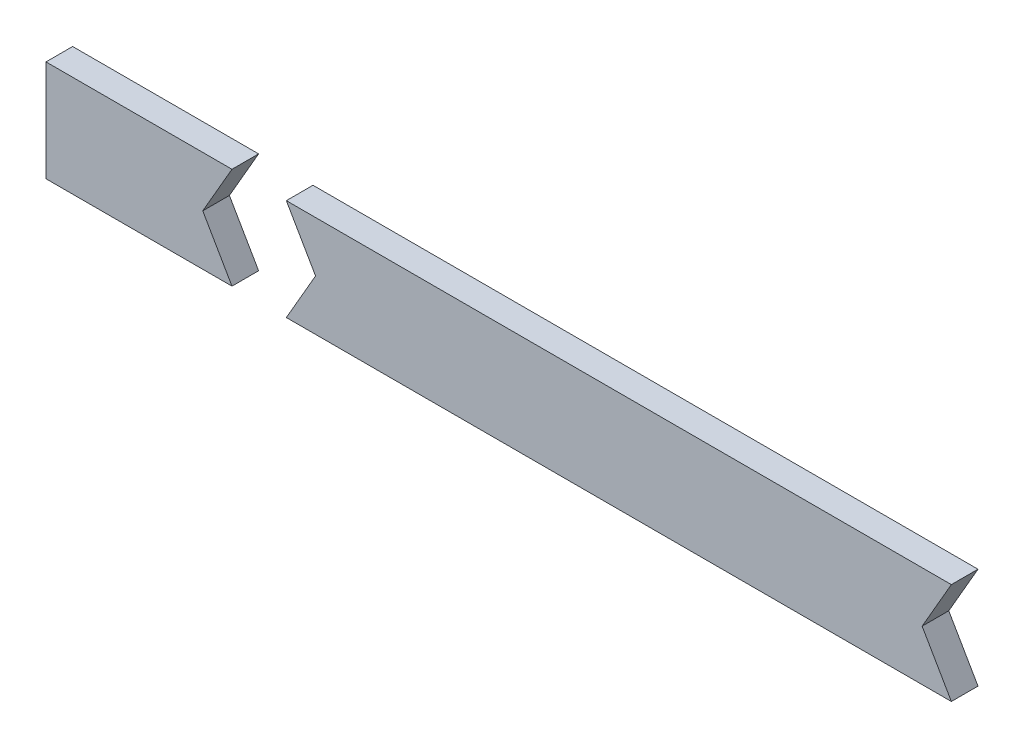
ISO-10303-21;
HEADER;
FILE_DESCRIPTION(('STEP AP214'),'2;1');
FILE_NAME('part.step','',(''),(''),'','','');
FILE_SCHEMA(('AUTOMOTIVE_DESIGN { 1 0 10303 214 1 1 1 1 }'));
ENDSEC;
DATA;
#1=APPLICATION_CONTEXT('core data for automotive mechanical design processes');
#2=APPLICATION_PROTOCOL_DEFINITION('international standard','automotive_design',2000,#1);
#3=PRODUCT_CONTEXT('',#1,'mechanical');
#4=PRODUCT('Part','Part','',(#3));
#5=PRODUCT_RELATED_PRODUCT_CATEGORY('part','',(#4));
#6=PRODUCT_DEFINITION_FORMATION('','',#4);
#7=PRODUCT_DEFINITION_CONTEXT('part definition',#1,'design');
#8=PRODUCT_DEFINITION('design','',#6,#7);
#9=PRODUCT_DEFINITION_SHAPE('','',#8);
#10=(LENGTH_UNIT() NAMED_UNIT(*) SI_UNIT(.MILLI.,.METRE.));
#11=(NAMED_UNIT(*) PLANE_ANGLE_UNIT() SI_UNIT($,.RADIAN.));
#12=(NAMED_UNIT(*) SI_UNIT($,.STERADIAN.) SOLID_ANGLE_UNIT());
#13=UNCERTAINTY_MEASURE_WITH_UNIT(LENGTH_MEASURE(1.E-05),#10,'distance_accuracy_value','');
#14=(GEOMETRIC_REPRESENTATION_CONTEXT(3) GLOBAL_UNCERTAINTY_ASSIGNED_CONTEXT((#13)) GLOBAL_UNIT_ASSIGNED_CONTEXT((#10,
#11,#12)) REPRESENTATION_CONTEXT('',''));
#15=CARTESIAN_POINT('',(0.,0.,0.));
#16=DIRECTION('',(0.,0.,1.));
#17=DIRECTION('',(1.,0.,0.));
#18=AXIS2_PLACEMENT_3D('',#15,#16,#17);
#19=CARTESIAN_POINT('',(50.9700217866475,2.85,39.3714518175661));
#20=DIRECTION('',(0.,-1.,0.));
#21=DIRECTION('',(0.,0.,-1.));
#22=AXIS2_PLACEMENT_3D('',#19,#20,#21);
#23=PLANE('',#22);
#24=DIRECTION('',(-1.,0.,0.));
#25=VECTOR('',#24,1.);
#26=CARTESIAN_POINT('',(50.9700217866475,2.85,1.5));
#27=LINE('',#26,#25);
#28=CARTESIAN_POINT('',(50.9700217866475,2.85,1.5));
#29=VERTEX_POINT('',#28);
#30=CARTESIAN_POINT('',(13.5299782133525,2.85,1.5));
#31=VERTEX_POINT('',#30);
#32=EDGE_CURVE('E124',#29,#31,#27,.T.);
#33=ORIENTED_EDGE('',*,*,#32,.F.);
#34=DIRECTION('',(0.,0.,-1.));
#35=VECTOR('',#34,1.);
#36=CARTESIAN_POINT('',(50.9700217866475,2.85,39.3714518175661));
#37=LINE('',#36,#35);
#38=CARTESIAN_POINT('',(50.9700217866475,2.85,0.));
#39=VERTEX_POINT('',#38);
#40=EDGE_CURVE('E47',#29,#39,#37,.T.);
#41=ORIENTED_EDGE('',*,*,#40,.T.);
#42=DIRECTION('',(-1.,0.,0.));
#43=VECTOR('',#42,1.);
#44=CARTESIAN_POINT('',(50.9700217866475,2.85,0.));
#45=LINE('',#44,#43);
#46=CARTESIAN_POINT('',(13.5299782133525,2.85,0.));
#47=VERTEX_POINT('',#46);
#48=EDGE_CURVE('E132',#39,#47,#45,.T.);
#49=ORIENTED_EDGE('',*,*,#48,.T.);
#50=DIRECTION('',(0.,0.,-1.));
#51=VECTOR('',#50,1.);
#52=CARTESIAN_POINT('',(13.5299782133525,2.85,39.3714518175661));
#53=LINE('',#52,#51);
#54=EDGE_CURVE('E90',#31,#47,#53,.T.);
#55=ORIENTED_EDGE('',*,*,#54,.F.);
#56=EDGE_LOOP('',(#33,#41,#49,#55));
#57=FACE_BOUND('',#56,.T.);
#58=ADVANCED_FACE('F43',(#57),#23,.F.);
#59=CARTESIAN_POINT('',(13.5299782133525,2.85,39.3714518175661));
#60=DIRECTION('',(0.866025403784441,0.499999999999997,0.));
#61=DIRECTION('',(-0.499999999999997,0.866025403784441,0.));
#62=AXIS2_PLACEMENT_3D('',#59,#60,#61);
#63=PLANE('',#62);
#64=DIRECTION('',(0.499999999999997,-0.866025403784441,0.));
#65=VECTOR('',#64,1.);
#66=CARTESIAN_POINT('',(13.5299782133525,2.85,1.5));
#67=LINE('',#66,#65);
#68=CARTESIAN_POINT('',(15.1754264805429,0.,1.5));
#69=VERTEX_POINT('',#68);
#70=EDGE_CURVE('E97',#31,#69,#67,.T.);
#71=ORIENTED_EDGE('',*,*,#70,.F.);
#72=ORIENTED_EDGE('',*,*,#54,.T.);
#73=DIRECTION('',(0.499999999999997,-0.86602540378444,0.));
#74=VECTOR('',#73,1.);
#75=CARTESIAN_POINT('',(13.5299782133525,2.85,0.));
#76=LINE('',#75,#74);
#77=CARTESIAN_POINT('',(15.1754264805429,0.,0.));
#78=VERTEX_POINT('',#77);
#79=EDGE_CURVE('E131',#47,#78,#76,.T.);
#80=ORIENTED_EDGE('',*,*,#79,.T.);
#81=DIRECTION('',(0.,0.,-1.));
#82=VECTOR('',#81,1.);
#83=CARTESIAN_POINT('',(15.1754264805429,0.,39.3714518175661));
#84=LINE('',#83,#82);
#85=EDGE_CURVE('E133',#69,#78,#84,.T.);
#86=ORIENTED_EDGE('',*,*,#85,.F.);
#87=EDGE_LOOP('',(#71,#72,#80,#86));
#88=FACE_BOUND('',#87,.T.);
#89=ADVANCED_FACE('F151',(#88),#63,.F.);
#90=CARTESIAN_POINT('',(15.1754264805429,0.,39.3714518175661));
#91=DIRECTION('',(0.866025403784439,-0.499999999999999,0.));
#92=DIRECTION('',(0.499999999999999,0.866025403784439,0.));
#93=AXIS2_PLACEMENT_3D('',#90,#91,#92);
#94=PLANE('',#93);
#95=DIRECTION('',(-0.499999999999999,-0.866025403784439,0.));
#96=VECTOR('',#95,1.);
#97=CARTESIAN_POINT('',(15.1754264805429,0.,1.5));
#98=LINE('',#97,#96);
#99=CARTESIAN_POINT('',(13.5299782133525,-2.85,1.5));
#100=VERTEX_POINT('',#99);
#101=EDGE_CURVE('E118',#69,#100,#98,.T.);
#102=ORIENTED_EDGE('',*,*,#101,.F.);
#103=ORIENTED_EDGE('',*,*,#85,.T.);
#104=DIRECTION('',(-0.499999999999999,-0.866025403784439,0.));
#105=VECTOR('',#104,1.);
#106=CARTESIAN_POINT('',(15.1754264805429,0.,0.));
#107=LINE('',#106,#105);
#108=CARTESIAN_POINT('',(13.5299782133525,-2.85,0.));
#109=VERTEX_POINT('',#108);
#110=EDGE_CURVE('E135',#78,#109,#107,.T.);
#111=ORIENTED_EDGE('',*,*,#110,.T.);
#112=DIRECTION('',(0.,0.,-1.));
#113=VECTOR('',#112,1.);
#114=CARTESIAN_POINT('',(13.5299782133525,-2.85,39.3714518175661));
#115=LINE('',#114,#113);
#116=EDGE_CURVE('E136',#100,#109,#115,.T.);
#117=ORIENTED_EDGE('',*,*,#116,.F.);
#118=EDGE_LOOP('',(#102,#103,#111,#117));
#119=FACE_BOUND('',#118,.T.);
#120=ADVANCED_FACE('F153',(#119),#94,.F.);
#121=CARTESIAN_POINT('',(13.5299782133525,-2.85,39.3714518175661));
#122=DIRECTION('',(0.,1.,0.));
#123=DIRECTION('',(0.,0.,1.));
#124=AXIS2_PLACEMENT_3D('',#121,#122,#123);
#125=PLANE('',#124);
#126=DIRECTION('',(1.,0.,0.));
#127=VECTOR('',#126,1.);
#128=CARTESIAN_POINT('',(13.5299782133525,-2.85,1.5));
#129=LINE('',#128,#127);
#130=CARTESIAN_POINT('',(50.9700217866475,-2.85,1.5));
#131=VERTEX_POINT('',#130);
#132=EDGE_CURVE('E52',#100,#131,#129,.T.);
#133=ORIENTED_EDGE('',*,*,#132,.F.);
#134=ORIENTED_EDGE('',*,*,#116,.T.);
#135=DIRECTION('',(1.,0.,0.));
#136=VECTOR('',#135,1.);
#137=CARTESIAN_POINT('',(13.5299782133525,-2.85,0.));
#138=LINE('',#137,#136);
#139=CARTESIAN_POINT('',(50.9700217866475,-2.85,0.));
#140=VERTEX_POINT('',#139);
#141=EDGE_CURVE('E113',#109,#140,#138,.T.);
#142=ORIENTED_EDGE('',*,*,#141,.T.);
#143=DIRECTION('',(0.,0.,-1.));
#144=VECTOR('',#143,1.);
#145=CARTESIAN_POINT('',(50.9700217866475,-2.85,39.3714518175661));
#146=LINE('',#145,#144);
#147=EDGE_CURVE('E104',#131,#140,#146,.T.);
#148=ORIENTED_EDGE('',*,*,#147,.F.);
#149=EDGE_LOOP('',(#133,#134,#142,#148));
#150=FACE_BOUND('',#149,.T.);
#151=ADVANCED_FACE('F110',(#150),#125,.F.);
#152=CARTESIAN_POINT('',(50.9700217866475,-2.85,39.3714518175661));
#153=DIRECTION('',(-0.866025403784437,-0.500000000000003,0.));
#154=DIRECTION('',(0.500000000000003,-0.866025403784437,0.));
#155=AXIS2_PLACEMENT_3D('',#152,#153,#154);
#156=PLANE('',#155);
#157=DIRECTION('',(-0.500000000000003,0.866025403784437,0.));
#158=VECTOR('',#157,1.);
#159=CARTESIAN_POINT('',(50.9700217866475,-2.85,1.5));
#160=LINE('',#159,#158);
#161=CARTESIAN_POINT('',(49.3245735194571,0.,1.5));
#162=VERTEX_POINT('',#161);
#163=EDGE_CURVE('E12',#131,#162,#160,.T.);
#164=ORIENTED_EDGE('',*,*,#163,.F.);
#165=ORIENTED_EDGE('',*,*,#147,.T.);
#166=DIRECTION('',(-0.500000000000003,0.866025403784437,0.));
#167=VECTOR('',#166,1.);
#168=CARTESIAN_POINT('',(50.9700217866475,-2.85,0.));
#169=LINE('',#168,#167);
#170=CARTESIAN_POINT('',(49.3245735194571,0.,0.));
#171=VERTEX_POINT('',#170);
#172=EDGE_CURVE('E115',#140,#171,#169,.T.);
#173=ORIENTED_EDGE('',*,*,#172,.T.);
#174=DIRECTION('',(0.,0.,-1.));
#175=VECTOR('',#174,1.);
#176=CARTESIAN_POINT('',(49.3245735194571,0.,39.3714518175661));
#177=LINE('',#176,#175);
#178=EDGE_CURVE('E65',#162,#171,#177,.T.);
#179=ORIENTED_EDGE('',*,*,#178,.F.);
#180=EDGE_LOOP('',(#164,#165,#173,#179));
#181=FACE_BOUND('',#180,.T.);
#182=ADVANCED_FACE('F103',(#181),#156,.F.);
#183=CARTESIAN_POINT('',(49.3245735194571,0.,39.3714518175661));
#184=DIRECTION('',(-0.866025403784439,0.499999999999999,0.));
#185=DIRECTION('',(-0.499999999999999,-0.866025403784439,0.));
#186=AXIS2_PLACEMENT_3D('',#183,#184,#185);
#187=PLANE('',#186);
#188=DIRECTION('',(0.499999999999999,0.866025403784439,0.));
#189=VECTOR('',#188,1.);
#190=CARTESIAN_POINT('',(49.3245735194571,0.,1.5));
#191=LINE('',#190,#189);
#192=EDGE_CURVE('E127',#162,#29,#191,.T.);
#193=ORIENTED_EDGE('',*,*,#192,.F.);
#194=ORIENTED_EDGE('',*,*,#178,.T.);
#195=DIRECTION('',(0.499999999999999,0.866025403784439,0.));
#196=VECTOR('',#195,1.);
#197=CARTESIAN_POINT('',(49.3245735194571,0.,0.));
#198=LINE('',#197,#196);
#199=EDGE_CURVE('E129',#171,#39,#198,.T.);
#200=ORIENTED_EDGE('',*,*,#199,.T.);
#201=ORIENTED_EDGE('',*,*,#40,.F.);
#202=EDGE_LOOP('',(#193,#194,#200,#201));
#203=FACE_BOUND('',#202,.T.);
#204=ADVANCED_FACE('F147',(#203),#187,.F.);
#205=CARTESIAN_POINT('',(0.,0.,0.));
#206=DIRECTION('',(0.,0.,1.));
#207=DIRECTION('',(1.,0.,0.));
#208=AXIS2_PLACEMENT_3D('',#205,#206,#207);
#209=PLANE('',#208);
#210=ORIENTED_EDGE('',*,*,#48,.F.);
#211=ORIENTED_EDGE('',*,*,#199,.F.);
#212=ORIENTED_EDGE('',*,*,#172,.F.);
#213=ORIENTED_EDGE('',*,*,#141,.F.);
#214=ORIENTED_EDGE('',*,*,#110,.F.);
#215=ORIENTED_EDGE('',*,*,#79,.F.);
#216=EDGE_LOOP('',(#210,#211,#212,#213,#214,#215));
#217=FACE_BOUND('',#216,.T.);
#218=ADVANCED_FACE('F149',(#217),#209,.F.);
#219=CARTESIAN_POINT('',(0.,0.,1.5));
#220=DIRECTION('',(0.,0.,1.));
#221=DIRECTION('',(1.,0.,0.));
#222=AXIS2_PLACEMENT_3D('',#219,#220,#221);
#223=PLANE('',#222);
#224=ORIENTED_EDGE('',*,*,#192,.T.);
#225=ORIENTED_EDGE('',*,*,#32,.T.);
#226=ORIENTED_EDGE('',*,*,#70,.T.);
#227=ORIENTED_EDGE('',*,*,#101,.T.);
#228=ORIENTED_EDGE('',*,*,#132,.T.);
#229=ORIENTED_EDGE('',*,*,#163,.T.);
#230=EDGE_LOOP('',(#224,#225,#226,#227,#228,#229));
#231=FACE_BOUND('',#230,.T.);
#232=ADVANCED_FACE('F45',(#231),#223,.T.);
#233=CLOSED_SHELL('',(#58,#89,#120,#151,#182,#204,#218,#232));
#234=MANIFOLD_SOLID_BREP('B2',#233);
#235=CARTESIAN_POINT('',(10.4700217866475,2.85,1.5));
#236=DIRECTION('',(0.,-1.,0.));
#237=DIRECTION('',(0.,0.,-1.));
#238=AXIS2_PLACEMENT_3D('',#235,#236,#237);
#239=PLANE('',#238);
#240=DIRECTION('',(-1.,0.,0.));
#241=VECTOR('',#240,1.);
#242=CARTESIAN_POINT('',(10.4700217866475,2.85,0.));
#243=LINE('',#242,#241);
#244=CARTESIAN_POINT('',(10.4700217866475,2.85,0.));
#245=VERTEX_POINT('',#244);
#246=CARTESIAN_POINT('',(0.,2.85,0.));
#247=VERTEX_POINT('',#246);
#248=EDGE_CURVE('E292',#245,#247,#243,.T.);
#249=ORIENTED_EDGE('',*,*,#248,.T.);
#250=DIRECTION('',(0.,0.,-1.));
#251=VECTOR('',#250,1.);
#252=CARTESIAN_POINT('',(0.,2.85,1.5));
#253=LINE('',#252,#251);
#254=CARTESIAN_POINT('',(0.,2.85,1.5));
#255=VERTEX_POINT('',#254);
#256=EDGE_CURVE('E41',#255,#247,#253,.T.);
#257=ORIENTED_EDGE('',*,*,#256,.F.);
#258=DIRECTION('',(-1.,0.,0.));
#259=VECTOR('',#258,1.);
#260=CARTESIAN_POINT('',(10.4700217866475,2.85,1.5));
#261=LINE('',#260,#259);
#262=CARTESIAN_POINT('',(10.4700217866475,2.85,1.5));
#263=VERTEX_POINT('',#262);
#264=EDGE_CURVE('E300',#263,#255,#261,.T.);
#265=ORIENTED_EDGE('',*,*,#264,.F.);
#266=DIRECTION('',(0.,0.,-1.));
#267=VECTOR('',#266,1.);
#268=CARTESIAN_POINT('',(10.4700217866475,2.85,1.5));
#269=LINE('',#268,#267);
#270=EDGE_CURVE('E288',#263,#245,#269,.T.);
#271=ORIENTED_EDGE('',*,*,#270,.T.);
#272=EDGE_LOOP('',(#249,#257,#265,#271));
#273=FACE_BOUND('',#272,.T.);
#274=ADVANCED_FACE('F218',(#273),#239,.F.);
#275=CARTESIAN_POINT('',(0.,2.85,1.5));
#276=DIRECTION('',(1.,0.,0.));
#277=DIRECTION('',(0.,0.,-1.));
#278=AXIS2_PLACEMENT_3D('',#275,#276,#277);
#279=PLANE('',#278);
#280=DIRECTION('',(0.,-1.,0.));
#281=VECTOR('',#280,1.);
#282=CARTESIAN_POINT('',(0.,2.85,0.));
#283=LINE('',#282,#281);
#284=CARTESIAN_POINT('',(0.,-2.85,0.));
#285=VERTEX_POINT('',#284);
#286=EDGE_CURVE('E295',#247,#285,#283,.T.);
#287=ORIENTED_EDGE('',*,*,#286,.T.);
#288=DIRECTION('',(0.,0.,-1.));
#289=VECTOR('',#288,1.);
#290=CARTESIAN_POINT('',(0.,-2.85,1.5));
#291=LINE('',#290,#289);
#292=CARTESIAN_POINT('',(0.,-2.85,1.5));
#293=VERTEX_POINT('',#292);
#294=EDGE_CURVE('E226',#293,#285,#291,.T.);
#295=ORIENTED_EDGE('',*,*,#294,.F.);
#296=DIRECTION('',(0.,-1.,0.));
#297=VECTOR('',#296,1.);
#298=CARTESIAN_POINT('',(0.,2.85,1.5));
#299=LINE('',#298,#297);
#300=EDGE_CURVE('E268',#255,#293,#299,.T.);
#301=ORIENTED_EDGE('',*,*,#300,.F.);
#302=ORIENTED_EDGE('',*,*,#256,.T.);
#303=EDGE_LOOP('',(#287,#295,#301,#302));
#304=FACE_BOUND('',#303,.T.);
#305=ADVANCED_FACE('F319',(#304),#279,.F.);
#306=CARTESIAN_POINT('',(0.,-2.85,1.5));
#307=DIRECTION('',(0.,1.,0.));
#308=DIRECTION('',(0.,0.,1.));
#309=AXIS2_PLACEMENT_3D('',#306,#307,#308);
#310=PLANE('',#309);
#311=DIRECTION('',(1.,0.,0.));
#312=VECTOR('',#311,1.);
#313=CARTESIAN_POINT('',(0.,-2.85,0.));
#314=LINE('',#313,#312);
#315=CARTESIAN_POINT('',(10.4700217866475,-2.85,0.));
#316=VERTEX_POINT('',#315);
#317=EDGE_CURVE('E283',#285,#316,#314,.T.);
#318=ORIENTED_EDGE('',*,*,#317,.T.);
#319=DIRECTION('',(0.,0.,-1.));
#320=VECTOR('',#319,1.);
#321=CARTESIAN_POINT('',(10.4700217866475,-2.85,1.5));
#322=LINE('',#321,#320);
#323=CARTESIAN_POINT('',(10.4700217866475,-2.85,1.5));
#324=VERTEX_POINT('',#323);
#325=EDGE_CURVE('E280',#324,#316,#322,.T.);
#326=ORIENTED_EDGE('',*,*,#325,.F.);
#327=DIRECTION('',(1.,0.,0.));
#328=VECTOR('',#327,1.);
#329=CARTESIAN_POINT('',(0.,-2.85,1.5));
#330=LINE('',#329,#328);
#331=EDGE_CURVE('E272',#293,#324,#330,.T.);
#332=ORIENTED_EDGE('',*,*,#331,.F.);
#333=ORIENTED_EDGE('',*,*,#294,.T.);
#334=EDGE_LOOP('',(#318,#326,#332,#333));
#335=FACE_BOUND('',#334,.T.);
#336=ADVANCED_FACE('F281',(#335),#310,.F.);
#337=CARTESIAN_POINT('',(10.4700217866475,-2.85,1.5));
#338=DIRECTION('',(-0.866025403784438,-0.5,0.));
#339=DIRECTION('',(0.5,-0.866025403784439,0.));
#340=AXIS2_PLACEMENT_3D('',#337,#338,#339);
#341=PLANE('',#340);
#342=DIRECTION('',(-0.5,0.866025403784439,0.));
#343=VECTOR('',#342,1.);
#344=CARTESIAN_POINT('',(10.4700217866475,-2.85,0.));
#345=LINE('',#344,#343);
#346=CARTESIAN_POINT('',(8.82457351945706,0.,0.));
#347=VERTEX_POINT('',#346);
#348=EDGE_CURVE('E254',#316,#347,#345,.T.);
#349=ORIENTED_EDGE('',*,*,#348,.T.);
#350=DIRECTION('',(0.,0.,-1.));
#351=VECTOR('',#350,1.);
#352=CARTESIAN_POINT('',(8.82457351945706,0.,1.5));
#353=LINE('',#352,#351);
#354=CARTESIAN_POINT('',(8.82457351945706,0.,1.5));
#355=VERTEX_POINT('',#354);
#356=EDGE_CURVE('E284',#355,#347,#353,.T.);
#357=ORIENTED_EDGE('',*,*,#356,.F.);
#358=DIRECTION('',(-0.5,0.866025403784439,0.));
#359=VECTOR('',#358,1.);
#360=CARTESIAN_POINT('',(10.4700217866475,-2.85,1.5));
#361=LINE('',#360,#359);
#362=EDGE_CURVE('E276',#324,#355,#361,.T.);
#363=ORIENTED_EDGE('',*,*,#362,.F.);
#364=ORIENTED_EDGE('',*,*,#325,.T.);
#365=EDGE_LOOP('',(#349,#357,#363,#364));
#366=FACE_BOUND('',#365,.T.);
#367=ADVANCED_FACE('F286',(#366),#341,.F.);
#368=CARTESIAN_POINT('',(8.82457351945706,0.,1.5));
#369=DIRECTION('',(-0.866025403784439,0.5,0.));
#370=DIRECTION('',(-0.5,-0.866025403784439,0.));
#371=AXIS2_PLACEMENT_3D('',#368,#369,#370);
#372=PLANE('',#371);
#373=DIRECTION('',(0.5,0.866025403784439,0.));
#374=VECTOR('',#373,1.);
#375=CARTESIAN_POINT('',(8.82457351945706,0.,0.));
#376=LINE('',#375,#374);
#377=EDGE_CURVE('E260',#347,#245,#376,.T.);
#378=ORIENTED_EDGE('',*,*,#377,.T.);
#379=ORIENTED_EDGE('',*,*,#270,.F.);
#380=DIRECTION('',(0.5,0.866025403784439,0.));
#381=VECTOR('',#380,1.);
#382=CARTESIAN_POINT('',(8.82457351945706,0.,1.5));
#383=LINE('',#382,#381);
#384=EDGE_CURVE('E234',#355,#263,#383,.T.);
#385=ORIENTED_EDGE('',*,*,#384,.F.);
#386=ORIENTED_EDGE('',*,*,#356,.T.);
#387=EDGE_LOOP('',(#378,#379,#385,#386));
#388=FACE_BOUND('',#387,.T.);
#389=ADVANCED_FACE('F308',(#388),#372,.F.);
#390=CARTESIAN_POINT('',(0.,0.,1.5));
#391=DIRECTION('',(0.,0.,1.));
#392=DIRECTION('',(1.,0.,0.));
#393=AXIS2_PLACEMENT_3D('',#390,#391,#392);
#394=PLANE('',#393);
#395=ORIENTED_EDGE('',*,*,#264,.T.);
#396=ORIENTED_EDGE('',*,*,#300,.T.);
#397=ORIENTED_EDGE('',*,*,#331,.T.);
#398=ORIENTED_EDGE('',*,*,#362,.T.);
#399=ORIENTED_EDGE('',*,*,#384,.T.);
#400=EDGE_LOOP('',(#395,#396,#397,#398,#399));
#401=FACE_BOUND('',#400,.T.);
#402=ADVANCED_FACE('F274',(#401),#394,.T.);
#403=CARTESIAN_POINT('',(0.,0.,0.));
#404=DIRECTION('',(0.,0.,1.));
#405=DIRECTION('',(1.,0.,0.));
#406=AXIS2_PLACEMENT_3D('',#403,#404,#405);
#407=PLANE('',#406);
#408=ORIENTED_EDGE('',*,*,#248,.F.);
#409=ORIENTED_EDGE('',*,*,#377,.F.);
#410=ORIENTED_EDGE('',*,*,#348,.F.);
#411=ORIENTED_EDGE('',*,*,#317,.F.);
#412=ORIENTED_EDGE('',*,*,#286,.F.);
#413=EDGE_LOOP('',(#408,#409,#410,#411,#412));
#414=FACE_BOUND('',#413,.T.);
#415=ADVANCED_FACE('F304',(#414),#407,.F.);
#416=CLOSED_SHELL('',(#274,#305,#336,#367,#389,#402,#415));
#417=MANIFOLD_SOLID_BREP('B6',#416);
#418=ADVANCED_BREP_SHAPE_REPRESENTATION('',(#18,#234,#417),#14);
#419=SHAPE_DEFINITION_REPRESENTATION(#9,#418);
ENDSEC;
END-ISO-10303-21;
